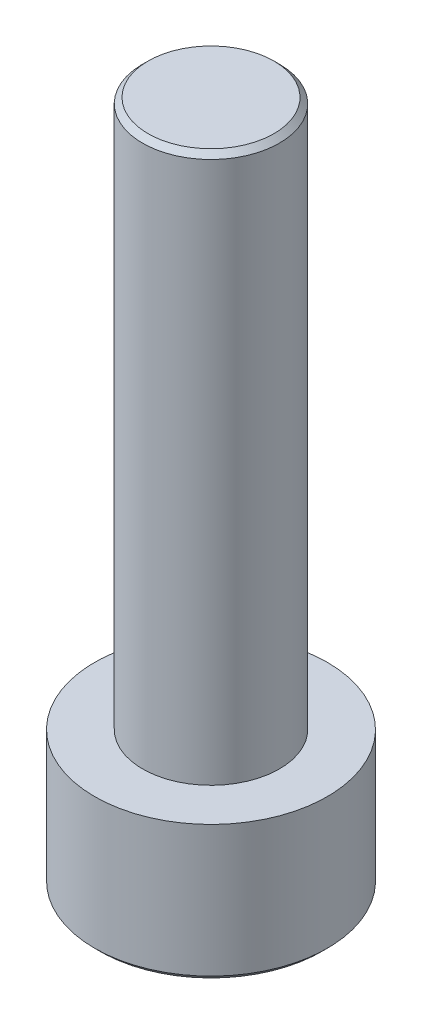
ISO-10303-21;
HEADER;
FILE_DESCRIPTION(('STEP AP214'),'2;1');
FILE_NAME('part.step','',(''),(''),'','','');
FILE_SCHEMA(('AUTOMOTIVE_DESIGN { 1 0 10303 214 1 1 1 1 }'));
ENDSEC;
DATA;
#1=APPLICATION_CONTEXT('core data for automotive mechanical design processes');
#2=APPLICATION_PROTOCOL_DEFINITION('international standard','automotive_design',2000,#1);
#3=PRODUCT_CONTEXT('',#1,'mechanical');
#4=PRODUCT('Part','Part','',(#3));
#5=PRODUCT_RELATED_PRODUCT_CATEGORY('part','',(#4));
#6=PRODUCT_DEFINITION_FORMATION('','',#4);
#7=PRODUCT_DEFINITION_CONTEXT('part definition',#1,'design');
#8=PRODUCT_DEFINITION('design','',#6,#7);
#9=PRODUCT_DEFINITION_SHAPE('','',#8);
#10=(LENGTH_UNIT() NAMED_UNIT(*) SI_UNIT(.MILLI.,.METRE.));
#11=(NAMED_UNIT(*) PLANE_ANGLE_UNIT() SI_UNIT($,.RADIAN.));
#12=(NAMED_UNIT(*) SI_UNIT($,.STERADIAN.) SOLID_ANGLE_UNIT());
#13=UNCERTAINTY_MEASURE_WITH_UNIT(LENGTH_MEASURE(1.E-05),#10,'distance_accuracy_value','');
#14=(GEOMETRIC_REPRESENTATION_CONTEXT(3) GLOBAL_UNCERTAINTY_ASSIGNED_CONTEXT((#13)) GLOBAL_UNIT_ASSIGNED_CONTEXT((#10,
#11,#12)) REPRESENTATION_CONTEXT('',''));
#15=CARTESIAN_POINT('',(0.,0.,0.));
#16=DIRECTION('',(0.,0.,1.));
#17=DIRECTION('',(1.,0.,0.));
#18=AXIS2_PLACEMENT_3D('',#15,#16,#17);
#19=CARTESIAN_POINT('',(0.,-5.,0.));
#20=DIRECTION('',(0.,-1.,0.));
#21=DIRECTION('',(0.,0.,-1.));
#22=AXIS2_PLACEMENT_3D('',#19,#20,#21);
#23=PLANE('',#22);
#24=CARTESIAN_POINT('',(0.,-5.,0.));
#25=DIRECTION('',(0.,-1.,0.));
#26=DIRECTION('',(0.,0.,-1.));
#27=AXIS2_PLACEMENT_3D('',#24,#25,#26);
#28=CIRCLE('',#27,4.05);
#29=CARTESIAN_POINT('',(0.,-5.,-4.05));
#30=VERTEX_POINT('',#29);
#31=EDGE_CURVE('E11',#30,#30,#28,.T.);
#32=ORIENTED_EDGE('',*,*,#31,.T.);
#33=EDGE_LOOP('',(#32));
#34=FACE_BOUND('',#33,.T.);
#35=DIRECTION('',(0.5,0.,-0.866025403784439));
#36=VECTOR('',#35,1.);
#37=CARTESIAN_POINT('',(2.3094010767585,-5.,0.));
#38=LINE('',#37,#36);
#39=CARTESIAN_POINT('',(1.15470053837925,-5.,2.));
#40=VERTEX_POINT('',#39);
#41=CARTESIAN_POINT('',(2.3094010767585,-5.,0.));
#42=VERTEX_POINT('',#41);
#43=EDGE_CURVE('E131',#40,#42,#38,.T.);
#44=ORIENTED_EDGE('',*,*,#43,.T.);
#45=DIRECTION('',(-0.5,0.,-0.866025403784439));
#46=VECTOR('',#45,1.);
#47=CARTESIAN_POINT('',(1.15470053837925,-5.,-2.));
#48=LINE('',#47,#46);
#49=CARTESIAN_POINT('',(1.15470053837925,-5.,-2.));
#50=VERTEX_POINT('',#49);
#51=EDGE_CURVE('E51',#42,#50,#48,.T.);
#52=ORIENTED_EDGE('',*,*,#51,.T.);
#53=DIRECTION('',(-1.,0.,0.));
#54=VECTOR('',#53,1.);
#55=CARTESIAN_POINT('',(-1.15470053837925,-5.,-2.));
#56=LINE('',#55,#54);
#57=CARTESIAN_POINT('',(-1.15470053837925,-5.,-2.));
#58=VERTEX_POINT('',#57);
#59=EDGE_CURVE('E122',#50,#58,#56,.T.);
#60=ORIENTED_EDGE('',*,*,#59,.T.);
#61=DIRECTION('',(-0.5,0.,0.866025403784439));
#62=VECTOR('',#61,1.);
#63=CARTESIAN_POINT('',(-2.3094010767585,-5.,0.));
#64=LINE('',#63,#62);
#65=CARTESIAN_POINT('',(-2.3094010767585,-5.,0.));
#66=VERTEX_POINT('',#65);
#67=EDGE_CURVE('E125',#58,#66,#64,.T.);
#68=ORIENTED_EDGE('',*,*,#67,.T.);
#69=DIRECTION('',(0.5,0.,0.866025403784439));
#70=VECTOR('',#69,1.);
#71=CARTESIAN_POINT('',(-1.15470053837925,-5.,2.));
#72=LINE('',#71,#70);
#73=CARTESIAN_POINT('',(-1.15470053837925,-5.,2.));
#74=VERTEX_POINT('',#73);
#75=EDGE_CURVE('E128',#66,#74,#72,.T.);
#76=ORIENTED_EDGE('',*,*,#75,.T.);
#77=DIRECTION('',(1.,0.,0.));
#78=VECTOR('',#77,1.);
#79=CARTESIAN_POINT('',(1.15470053837925,-5.,2.));
#80=LINE('',#79,#78);
#81=EDGE_CURVE('E112',#74,#40,#80,.T.);
#82=ORIENTED_EDGE('',*,*,#81,.T.);
#83=EDGE_LOOP('',(#44,#52,#60,#68,#76,#82));
#84=FACE_BOUND('',#83,.T.);
#85=ADVANCED_FACE('F37',(#34,#84),#23,.T.);
#86=CARTESIAN_POINT('',(0.,-5.,0.));
#87=DIRECTION('',(0.,1.,0.));
#88=DIRECTION('',(0.,0.,1.));
#89=AXIS2_PLACEMENT_3D('',#86,#87,#88);
#90=CONICAL_SURFACE('',#89,4.05,0.785398163397505);
#91=CARTESIAN_POINT('',(0.,-4.80000000000003,0.));
#92=DIRECTION('',(0.,-1.,0.));
#93=DIRECTION('',(0.,0.,-1.));
#94=AXIS2_PLACEMENT_3D('',#91,#92,#93);
#95=CIRCLE('',#94,4.25);
#96=CARTESIAN_POINT('',(0.,-4.80000000000003,-4.25));
#97=VERTEX_POINT('',#96);
#98=EDGE_CURVE('E44',#97,#97,#95,.T.);
#99=ORIENTED_EDGE('',*,*,#98,.T.);
#100=EDGE_LOOP('',(#99));
#101=FACE_BOUND('',#100,.T.);
#102=ORIENTED_EDGE('',*,*,#31,.F.);
#103=EDGE_LOOP('',(#102));
#104=FACE_BOUND('',#103,.T.);
#105=ADVANCED_FACE('F156',(#101,#104),#90,.T.);
#106=CARTESIAN_POINT('',(0.,-500.,0.));
#107=DIRECTION('',(0.,-1.,0.));
#108=DIRECTION('',(0.,0.,-1.));
#109=AXIS2_PLACEMENT_3D('',#106,#107,#108);
#110=CYLINDRICAL_SURFACE('',#109,4.25);
#111=CARTESIAN_POINT('',(0.,0.,0.));
#112=DIRECTION('',(0.,-1.,0.));
#113=DIRECTION('',(0.,0.,-1.));
#114=AXIS2_PLACEMENT_3D('',#111,#112,#113);
#115=CIRCLE('',#114,4.25);
#116=CARTESIAN_POINT('',(0.,0.,-4.25));
#117=VERTEX_POINT('',#116);
#118=EDGE_CURVE('E151',#117,#117,#115,.T.);
#119=ORIENTED_EDGE('',*,*,#118,.T.);
#120=EDGE_LOOP('',(#119));
#121=FACE_BOUND('',#120,.T.);
#122=ORIENTED_EDGE('',*,*,#98,.F.);
#123=EDGE_LOOP('',(#122));
#124=FACE_BOUND('',#123,.T.);
#125=ADVANCED_FACE('F159',(#121,#124),#110,.T.);
#126=CARTESIAN_POINT('',(4.25,0.,0.));
#127=DIRECTION('',(0.,1.,0.));
#128=DIRECTION('',(0.,0.,1.));
#129=AXIS2_PLACEMENT_3D('',#126,#127,#128);
#130=PLANE('',#129);
#131=CARTESIAN_POINT('',(0.,0.,0.));
#132=DIRECTION('',(0.,-1.,0.));
#133=DIRECTION('',(0.,0.,-1.));
#134=AXIS2_PLACEMENT_3D('',#131,#132,#133);
#135=CIRCLE('',#134,2.5);
#136=CARTESIAN_POINT('',(0.,0.,-2.5));
#137=VERTEX_POINT('',#136);
#138=EDGE_CURVE('E148',#137,#137,#135,.T.);
#139=ORIENTED_EDGE('',*,*,#138,.T.);
#140=EDGE_LOOP('',(#139));
#141=FACE_BOUND('',#140,.T.);
#142=ORIENTED_EDGE('',*,*,#118,.F.);
#143=EDGE_LOOP('',(#142));
#144=FACE_BOUND('',#143,.T.);
#145=ADVANCED_FACE('F161',(#141,#144),#130,.T.);
#146=CARTESIAN_POINT('',(0.,-500.,0.));
#147=DIRECTION('',(0.,-1.,0.));
#148=DIRECTION('',(0.,0.,-1.));
#149=AXIS2_PLACEMENT_3D('',#146,#147,#148);
#150=CYLINDRICAL_SURFACE('',#149,2.5);
#151=CARTESIAN_POINT('',(0.,19.8,0.));
#152=DIRECTION('',(0.,-1.,0.));
#153=DIRECTION('',(0.,0.,-1.));
#154=AXIS2_PLACEMENT_3D('',#151,#152,#153);
#155=CIRCLE('',#154,2.5);
#156=CARTESIAN_POINT('',(0.,19.8,-2.5));
#157=VERTEX_POINT('',#156);
#158=EDGE_CURVE('E145',#157,#157,#155,.T.);
#159=ORIENTED_EDGE('',*,*,#158,.T.);
#160=EDGE_LOOP('',(#159));
#161=FACE_BOUND('',#160,.T.);
#162=ORIENTED_EDGE('',*,*,#138,.F.);
#163=EDGE_LOOP('',(#162));
#164=FACE_BOUND('',#163,.T.);
#165=ADVANCED_FACE('F168',(#161,#164),#150,.T.);
#166=CARTESIAN_POINT('',(0.,19.8,0.));
#167=DIRECTION('',(0.,-1.,0.));
#168=DIRECTION('',(0.,0.,-1.));
#169=AXIS2_PLACEMENT_3D('',#166,#167,#168);
#170=CONICAL_SURFACE('',#169,2.5,0.785398163397504);
#171=CARTESIAN_POINT('',(0.,20.,0.));
#172=DIRECTION('',(0.,-1.,0.));
#173=DIRECTION('',(0.,0.,-1.));
#174=AXIS2_PLACEMENT_3D('',#171,#172,#173);
#175=CIRCLE('',#174,2.3);
#176=CARTESIAN_POINT('',(0.,20.,-2.3));
#177=VERTEX_POINT('',#176);
#178=EDGE_CURVE('E142',#177,#177,#175,.T.);
#179=ORIENTED_EDGE('',*,*,#178,.T.);
#180=EDGE_LOOP('',(#179));
#181=FACE_BOUND('',#180,.T.);
#182=ORIENTED_EDGE('',*,*,#158,.F.);
#183=EDGE_LOOP('',(#182));
#184=FACE_BOUND('',#183,.T.);
#185=ADVANCED_FACE('F201',(#181,#184),#170,.T.);
#186=CARTESIAN_POINT('',(2.3,20.,0.));
#187=DIRECTION('',(0.,1.,0.));
#188=DIRECTION('',(0.,0.,1.));
#189=AXIS2_PLACEMENT_3D('',#186,#187,#188);
#190=PLANE('',#189);
#191=ORIENTED_EDGE('',*,*,#178,.F.);
#192=EDGE_LOOP('',(#191));
#193=FACE_BOUND('',#192,.T.);
#194=ADVANCED_FACE('F195',(#193),#190,.T.);
#195=CARTESIAN_POINT('',(1.15470053837925,-2.5,-2.));
#196=DIRECTION('',(-0.866025403784439,0.,0.5));
#197=DIRECTION('',(0.5,0.,0.866025403784439));
#198=AXIS2_PLACEMENT_3D('',#195,#196,#197);
#199=PLANE('',#198);
#200=ORIENTED_EDGE('',*,*,#51,.F.);
#201=DIRECTION('',(0.,-1.,0.));
#202=VECTOR('',#201,1.);
#203=CARTESIAN_POINT('',(2.3094010767585,-2.5,0.));
#204=LINE('',#203,#202);
#205=CARTESIAN_POINT('',(2.3094010767585,-2.5,0.));
#206=VERTEX_POINT('',#205);
#207=EDGE_CURVE('E117',#206,#42,#204,.T.);
#208=ORIENTED_EDGE('',*,*,#207,.F.);
#209=DIRECTION('',(-0.5,0.,-0.866025403784439));
#210=VECTOR('',#209,1.);
#211=CARTESIAN_POINT('',(1.15470053837925,-2.5,-2.));
#212=LINE('',#211,#210);
#213=CARTESIAN_POINT('',(1.15470053837925,-2.5,-2.));
#214=VERTEX_POINT('',#213);
#215=EDGE_CURVE('E134',#206,#214,#212,.T.);
#216=ORIENTED_EDGE('',*,*,#215,.T.);
#217=DIRECTION('',(0.,-1.,0.));
#218=VECTOR('',#217,1.);
#219=CARTESIAN_POINT('',(1.15470053837925,-2.5,-2.));
#220=LINE('',#219,#218);
#221=EDGE_CURVE('E140',#214,#50,#220,.T.);
#222=ORIENTED_EDGE('',*,*,#221,.T.);
#223=EDGE_LOOP('',(#200,#208,#216,#222));
#224=FACE_BOUND('',#223,.T.);
#225=ADVANCED_FACE('F178',(#224),#199,.T.);
#226=CARTESIAN_POINT('',(-1.15470053837925,-2.5,-2.));
#227=DIRECTION('',(0.,0.,1.));
#228=DIRECTION('',(1.,0.,0.));
#229=AXIS2_PLACEMENT_3D('',#226,#227,#228);
#230=PLANE('',#229);
#231=ORIENTED_EDGE('',*,*,#59,.F.);
#232=ORIENTED_EDGE('',*,*,#221,.F.);
#233=DIRECTION('',(-1.,0.,0.));
#234=VECTOR('',#233,1.);
#235=CARTESIAN_POINT('',(-1.15470053837925,-2.5,-2.));
#236=LINE('',#235,#234);
#237=CARTESIAN_POINT('',(-1.15470053837925,-2.5,-2.));
#238=VERTEX_POINT('',#237);
#239=EDGE_CURVE('E90',#214,#238,#236,.T.);
#240=ORIENTED_EDGE('',*,*,#239,.T.);
#241=DIRECTION('',(0.,-1.,0.));
#242=VECTOR('',#241,1.);
#243=CARTESIAN_POINT('',(-1.15470053837925,-2.5,-2.));
#244=LINE('',#243,#242);
#245=EDGE_CURVE('E138',#238,#58,#244,.T.);
#246=ORIENTED_EDGE('',*,*,#245,.T.);
#247=EDGE_LOOP('',(#231,#232,#240,#246));
#248=FACE_BOUND('',#247,.T.);
#249=ADVANCED_FACE('F187',(#248),#230,.T.);
#250=CARTESIAN_POINT('',(-2.3094010767585,-2.5,0.));
#251=DIRECTION('',(0.866025403784439,0.,0.5));
#252=DIRECTION('',(0.5,0.,-0.866025403784439));
#253=AXIS2_PLACEMENT_3D('',#250,#251,#252);
#254=PLANE('',#253);
#255=ORIENTED_EDGE('',*,*,#67,.F.);
#256=ORIENTED_EDGE('',*,*,#245,.F.);
#257=DIRECTION('',(-0.5,0.,0.866025403784439));
#258=VECTOR('',#257,1.);
#259=CARTESIAN_POINT('',(-2.3094010767585,-2.5,0.));
#260=LINE('',#259,#258);
#261=CARTESIAN_POINT('',(-2.3094010767585,-2.5,0.));
#262=VERTEX_POINT('',#261);
#263=EDGE_CURVE('E108',#238,#262,#260,.T.);
#264=ORIENTED_EDGE('',*,*,#263,.T.);
#265=DIRECTION('',(0.,-1.,0.));
#266=VECTOR('',#265,1.);
#267=CARTESIAN_POINT('',(-2.3094010767585,-2.5,0.));
#268=LINE('',#267,#266);
#269=EDGE_CURVE('E105',#262,#66,#268,.T.);
#270=ORIENTED_EDGE('',*,*,#269,.T.);
#271=EDGE_LOOP('',(#255,#256,#264,#270));
#272=FACE_BOUND('',#271,.T.);
#273=ADVANCED_FACE('F185',(#272),#254,.T.);
#274=CARTESIAN_POINT('',(-1.15470053837925,-2.5,2.));
#275=DIRECTION('',(0.866025403784438,0.,-0.5));
#276=DIRECTION('',(-0.5,0.,-0.866025403784439));
#277=AXIS2_PLACEMENT_3D('',#274,#275,#276);
#278=PLANE('',#277);
#279=ORIENTED_EDGE('',*,*,#75,.F.);
#280=ORIENTED_EDGE('',*,*,#269,.F.);
#281=DIRECTION('',(0.5,0.,0.866025403784439));
#282=VECTOR('',#281,1.);
#283=CARTESIAN_POINT('',(-1.15470053837925,-2.5,2.));
#284=LINE('',#283,#282);
#285=CARTESIAN_POINT('',(-1.15470053837925,-2.5,2.));
#286=VERTEX_POINT('',#285);
#287=EDGE_CURVE('E100',#262,#286,#284,.T.);
#288=ORIENTED_EDGE('',*,*,#287,.T.);
#289=DIRECTION('',(0.,-1.,0.));
#290=VECTOR('',#289,1.);
#291=CARTESIAN_POINT('',(-1.15470053837925,-2.5,2.));
#292=LINE('',#291,#290);
#293=EDGE_CURVE('E104',#286,#74,#292,.T.);
#294=ORIENTED_EDGE('',*,*,#293,.T.);
#295=EDGE_LOOP('',(#279,#280,#288,#294));
#296=FACE_BOUND('',#295,.T.);
#297=ADVANCED_FACE('F103',(#296),#278,.T.);
#298=CARTESIAN_POINT('',(1.15470053837925,-2.5,2.));
#299=DIRECTION('',(0.,0.,-1.));
#300=DIRECTION('',(-1.,0.,0.));
#301=AXIS2_PLACEMENT_3D('',#298,#299,#300);
#302=PLANE('',#301);
#303=ORIENTED_EDGE('',*,*,#81,.F.);
#304=ORIENTED_EDGE('',*,*,#293,.F.);
#305=DIRECTION('',(1.,0.,0.));
#306=VECTOR('',#305,1.);
#307=CARTESIAN_POINT('',(1.15470053837925,-2.5,2.));
#308=LINE('',#307,#306);
#309=CARTESIAN_POINT('',(1.15470053837925,-2.5,2.));
#310=VERTEX_POINT('',#309);
#311=EDGE_CURVE('E107',#286,#310,#308,.T.);
#312=ORIENTED_EDGE('',*,*,#311,.T.);
#313=DIRECTION('',(0.,-1.,0.));
#314=VECTOR('',#313,1.);
#315=CARTESIAN_POINT('',(1.15470053837925,-2.5,2.));
#316=LINE('',#315,#314);
#317=EDGE_CURVE('E81',#310,#40,#316,.T.);
#318=ORIENTED_EDGE('',*,*,#317,.T.);
#319=EDGE_LOOP('',(#303,#304,#312,#318));
#320=FACE_BOUND('',#319,.T.);
#321=ADVANCED_FACE('F110',(#320),#302,.T.);
#322=CARTESIAN_POINT('',(2.3094010767585,-2.5,0.));
#323=DIRECTION('',(-0.866025403784439,0.,-0.5));
#324=DIRECTION('',(-0.5,0.,0.866025403784439));
#325=AXIS2_PLACEMENT_3D('',#322,#323,#324);
#326=PLANE('',#325);
#327=ORIENTED_EDGE('',*,*,#43,.F.);
#328=ORIENTED_EDGE('',*,*,#317,.F.);
#329=DIRECTION('',(0.5,0.,-0.866025403784439));
#330=VECTOR('',#329,1.);
#331=CARTESIAN_POINT('',(2.3094010767585,-2.5,0.));
#332=LINE('',#331,#330);
#333=EDGE_CURVE('E59',#310,#206,#332,.T.);
#334=ORIENTED_EDGE('',*,*,#333,.T.);
#335=ORIENTED_EDGE('',*,*,#207,.T.);
#336=EDGE_LOOP('',(#327,#328,#334,#335));
#337=FACE_BOUND('',#336,.T.);
#338=ADVANCED_FACE('F177',(#337),#326,.T.);
#339=CARTESIAN_POINT('',(0.,-2.5,0.));
#340=DIRECTION('',(0.,-1.,0.));
#341=DIRECTION('',(0.,0.,-1.));
#342=AXIS2_PLACEMENT_3D('',#339,#340,#341);
#343=PLANE('',#342);
#344=ORIENTED_EDGE('',*,*,#215,.F.);
#345=ORIENTED_EDGE('',*,*,#333,.F.);
#346=ORIENTED_EDGE('',*,*,#311,.F.);
#347=ORIENTED_EDGE('',*,*,#287,.F.);
#348=ORIENTED_EDGE('',*,*,#263,.F.);
#349=ORIENTED_EDGE('',*,*,#239,.F.);
#350=EDGE_LOOP('',(#344,#345,#346,#347,#348,#349));
#351=FACE_BOUND('',#350,.T.);
#352=ADVANCED_FACE('F115',(#351),#343,.T.);
#353=CLOSED_SHELL('',(#85,#105,#125,#145,#165,#185,#194,#225,#249,#273,#297,#321,#338,#352));
#354=MANIFOLD_SOLID_BREP('B2',#353);
#355=ADVANCED_BREP_SHAPE_REPRESENTATION('',(#18,#354),#14);
#356=SHAPE_DEFINITION_REPRESENTATION(#9,#355);
ENDSEC;
END-ISO-10303-21;
